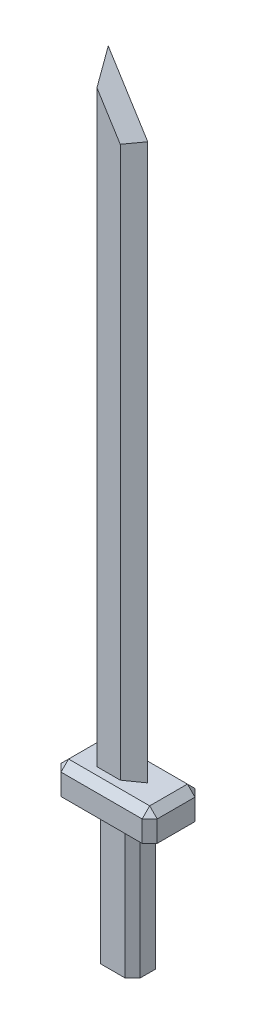
ISO-10303-21;
HEADER;
FILE_DESCRIPTION(('STEP AP214'),'2;1');
FILE_NAME('part.step','',(''),(''),'','','');
FILE_SCHEMA(('AUTOMOTIVE_DESIGN { 1 0 10303 214 1 1 1 1 }'));
ENDSEC;
DATA;
#1=APPLICATION_CONTEXT('core data for automotive mechanical design processes');
#2=APPLICATION_PROTOCOL_DEFINITION('international standard','automotive_design',2000,#1);
#3=PRODUCT_CONTEXT('',#1,'mechanical');
#4=PRODUCT('Part','Part','',(#3));
#5=PRODUCT_RELATED_PRODUCT_CATEGORY('part','',(#4));
#6=PRODUCT_DEFINITION_FORMATION('','',#4);
#7=PRODUCT_DEFINITION_CONTEXT('part definition',#1,'design');
#8=PRODUCT_DEFINITION('design','',#6,#7);
#9=PRODUCT_DEFINITION_SHAPE('','',#8);
#10=(LENGTH_UNIT() NAMED_UNIT(*) SI_UNIT(.MILLI.,.METRE.));
#11=(NAMED_UNIT(*) PLANE_ANGLE_UNIT() SI_UNIT($,.RADIAN.));
#12=(NAMED_UNIT(*) SI_UNIT($,.STERADIAN.) SOLID_ANGLE_UNIT());
#13=UNCERTAINTY_MEASURE_WITH_UNIT(LENGTH_MEASURE(1.E-05),#10,'distance_accuracy_value','');
#14=(GEOMETRIC_REPRESENTATION_CONTEXT(3) GLOBAL_UNCERTAINTY_ASSIGNED_CONTEXT((#13)) GLOBAL_UNIT_ASSIGNED_CONTEXT((#10,
#11,#12)) REPRESENTATION_CONTEXT('',''));
#15=CARTESIAN_POINT('',(0.,0.,0.));
#16=DIRECTION('',(0.,0.,1.));
#17=DIRECTION('',(1.,0.,0.));
#18=AXIS2_PLACEMENT_3D('',#15,#16,#17);
#19=CARTESIAN_POINT('',(-3.75819288838855,-3.80650951497684,3.5));
#20=DIRECTION('',(0.,1.,0.));
#21=DIRECTION('',(-1.,0.,0.));
#22=AXIS2_PLACEMENT_3D('',#19,#20,#21);
#23=PLANE('',#22);
#24=DIRECTION('',(1.,0.,0.));
#25=VECTOR('',#24,1.);
#26=CARTESIAN_POINT('',(-3.75819288838855,-3.80650951497684,-3.5));
#27=LINE('',#26,#25);
#28=CARTESIAN_POINT('',(-2.75819288838855,-3.80650951497684,-3.5));
#29=VERTEX_POINT('',#28);
#30=CARTESIAN_POINT('',(7.98968582877229,-3.80650951497684,-3.5));
#31=VERTEX_POINT('',#30);
#32=EDGE_CURVE('E359',#29,#31,#27,.T.);
#33=ORIENTED_EDGE('',*,*,#32,.T.);
#34=DIRECTION('',(0.707106781186548,0.,0.707106781186548));
#35=VECTOR('',#34,1.);
#36=CARTESIAN_POINT('',(7.98968582877228,-3.80650951497684,-3.50000000000001));
#37=LINE('',#36,#35);
#38=CARTESIAN_POINT('',(8.98968582877229,-3.80650951497684,-2.5));
#39=VERTEX_POINT('',#38);
#40=EDGE_CURVE('E311',#31,#39,#37,.T.);
#41=ORIENTED_EDGE('',*,*,#40,.T.);
#42=DIRECTION('',(0.,0.,-1.));
#43=VECTOR('',#42,1.);
#44=CARTESIAN_POINT('',(8.98968582877229,-3.80650951497684,3.5));
#45=LINE('',#44,#43);
#46=CARTESIAN_POINT('',(8.98968582877229,-3.80650951497684,2.5));
#47=VERTEX_POINT('',#46);
#48=EDGE_CURVE('E355',#47,#39,#45,.T.);
#49=ORIENTED_EDGE('',*,*,#48,.F.);
#50=DIRECTION('',(0.707106781186548,0.,-0.707106781186548));
#51=VECTOR('',#50,1.);
#52=CARTESIAN_POINT('',(8.98968582877228,-3.80650951497684,2.50000000000001));
#53=LINE('',#52,#51);
#54=CARTESIAN_POINT('',(7.98968582877229,-3.80650951497684,3.5));
#55=VERTEX_POINT('',#54);
#56=EDGE_CURVE('E315',#47,#55,#53,.F.);
#57=ORIENTED_EDGE('',*,*,#56,.T.);
#58=DIRECTION('',(1.,0.,0.));
#59=VECTOR('',#58,1.);
#60=CARTESIAN_POINT('',(-3.75819288838855,-3.80650951497684,3.5));
#61=LINE('',#60,#59);
#62=CARTESIAN_POINT('',(-2.75819288838855,-3.80650951497684,3.5));
#63=VERTEX_POINT('',#62);
#64=EDGE_CURVE('E358',#63,#55,#61,.T.);
#65=ORIENTED_EDGE('',*,*,#64,.F.);
#66=DIRECTION('',(-0.707106781186548,0.,-0.707106781186548));
#67=VECTOR('',#66,1.);
#68=CARTESIAN_POINT('',(-2.75819288838855,-3.80650951497684,3.5));
#69=LINE('',#68,#67);
#70=CARTESIAN_POINT('',(-3.75819288838855,-3.80650951497684,2.5));
#71=VERTEX_POINT('',#70);
#72=EDGE_CURVE('E317',#63,#71,#69,.T.);
#73=ORIENTED_EDGE('',*,*,#72,.T.);
#74=DIRECTION('',(0.,0.,-1.));
#75=VECTOR('',#74,1.);
#76=CARTESIAN_POINT('',(-3.75819288838855,-3.80650951497684,3.5));
#77=LINE('',#76,#75);
#78=CARTESIAN_POINT('',(-3.75819288838855,-3.80650951497684,-2.5));
#79=VERTEX_POINT('',#78);
#80=EDGE_CURVE('E349',#71,#79,#77,.T.);
#81=ORIENTED_EDGE('',*,*,#80,.T.);
#82=DIRECTION('',(-0.707106781186548,0.,0.707106781186548));
#83=VECTOR('',#82,1.);
#84=CARTESIAN_POINT('',(-3.75819288838855,-3.80650951497684,-2.5));
#85=LINE('',#84,#83);
#86=EDGE_CURVE('E313',#79,#29,#85,.F.);
#87=ORIENTED_EDGE('',*,*,#86,.T.);
#88=EDGE_LOOP('',(#33,#41,#49,#57,#65,#73,#81,#87));
#89=FACE_BOUND('',#88,.T.);
#90=DIRECTION('',(1.,0.,0.));
#91=VECTOR('',#90,1.);
#92=CARTESIAN_POINT('',(0.,-3.80650951497684,-2.));
#93=LINE('',#92,#91);
#94=CARTESIAN_POINT('',(1.,-3.80650951497684,-2.));
#95=VERTEX_POINT('',#94);
#96=CARTESIAN_POINT('',(4.23149294038372,-3.80650951497684,-2.));
#97=VERTEX_POINT('',#96);
#98=EDGE_CURVE('E233',#95,#97,#93,.T.);
#99=ORIENTED_EDGE('',*,*,#98,.F.);
#100=DIRECTION('',(-0.707106781186548,0.,0.707106781186548));
#101=VECTOR('',#100,1.);
#102=CARTESIAN_POINT('',(-4.12909644419427,-3.80650951497684,3.12909644419428));
#103=LINE('',#102,#101);
#104=CARTESIAN_POINT('',(0.,-3.80650951497684,-0.999999999999999));
#105=VERTEX_POINT('',#104);
#106=EDGE_CURVE('E267',#95,#105,#103,.T.);
#107=ORIENTED_EDGE('',*,*,#106,.T.);
#108=DIRECTION('',(0.,0.,-1.));
#109=VECTOR('',#108,1.);
#110=CARTESIAN_POINT('',(0.,-3.80650951497684,2.));
#111=LINE('',#110,#109);
#112=CARTESIAN_POINT('',(0.,-3.80650951497684,0.999999999999999));
#113=VERTEX_POINT('',#112);
#114=EDGE_CURVE('E362',#113,#105,#111,.T.);
#115=ORIENTED_EDGE('',*,*,#114,.F.);
#116=DIRECTION('',(-0.707106781186548,0.,-0.707106781186548));
#117=VECTOR('',#116,1.);
#118=CARTESIAN_POINT('',(-0.629096444194275,-3.80650951497684,0.370903555805724));
#119=LINE('',#118,#117);
#120=CARTESIAN_POINT('',(1.,-3.80650951497684,2.));
#121=VERTEX_POINT('',#120);
#122=EDGE_CURVE('E229',#113,#121,#119,.F.);
#123=ORIENTED_EDGE('',*,*,#122,.T.);
#124=DIRECTION('',(1.,0.,0.));
#125=VECTOR('',#124,1.);
#126=CARTESIAN_POINT('',(0.,-3.80650951497684,2.));
#127=LINE('',#126,#125);
#128=CARTESIAN_POINT('',(4.23149294038372,-3.80650951497684,2.));
#129=VERTEX_POINT('',#128);
#130=EDGE_CURVE('E380',#121,#129,#127,.T.);
#131=ORIENTED_EDGE('',*,*,#130,.T.);
#132=DIRECTION('',(0.707106781186548,0.,-0.707106781186547));
#133=VECTOR('',#132,1.);
#134=CARTESIAN_POINT('',(-0.513349974002418,-3.80650951497684,6.74484291438613));
#135=LINE('',#134,#133);
#136=CARTESIAN_POINT('',(5.23149294038372,-3.80650951497684,0.999999999999999));
#137=VERTEX_POINT('',#136);
#138=EDGE_CURVE('E265',#129,#137,#135,.T.);
#139=ORIENTED_EDGE('',*,*,#138,.T.);
#140=DIRECTION('',(0.,0.,-1.));
#141=VECTOR('',#140,1.);
#142=CARTESIAN_POINT('',(5.23149294038372,-3.80650951497684,2.));
#143=LINE('',#142,#141);
#144=CARTESIAN_POINT('',(5.23149294038372,-3.80650951497684,-0.999999999999999));
#145=VERTEX_POINT('',#144);
#146=EDGE_CURVE('E365',#137,#145,#143,.T.);
#147=ORIENTED_EDGE('',*,*,#146,.T.);
#148=DIRECTION('',(0.707106781186548,0.,0.707106781186547));
#149=VECTOR('',#148,1.);
#150=CARTESIAN_POINT('',(2.98665002599758,-3.80650951497684,-3.24484291438614));
#151=LINE('',#150,#149);
#152=EDGE_CURVE('E269',#145,#97,#151,.F.);
#153=ORIENTED_EDGE('',*,*,#152,.T.);
#154=EDGE_LOOP('',(#99,#107,#115,#123,#131,#139,#147,#153));
#155=FACE_BOUND('',#154,.T.);
#156=ADVANCED_FACE('F33',(#89,#155),#23,.F.);
#157=CARTESIAN_POINT('',(0.,0.,1.5));
#158=DIRECTION('',(-1.,0.,0.));
#159=DIRECTION('',(0.,0.,1.));
#160=AXIS2_PLACEMENT_3D('',#157,#158,#159);
#161=PLANE('',#160);
#162=DIRECTION('',(0.,1.,0.));
#163=VECTOR('',#162,1.);
#164=CARTESIAN_POINT('',(0.,0.,1.5));
#165=LINE('',#164,#163);
#166=CARTESIAN_POINT('',(0.,0.,1.5));
#167=VERTEX_POINT('',#166);
#168=CARTESIAN_POINT('',(0.,77.9007353647012,1.5));
#169=VERTEX_POINT('',#168);
#170=EDGE_CURVE('E344',#167,#169,#165,.T.);
#171=ORIENTED_EDGE('',*,*,#170,.T.);
#172=DIRECTION('',(0.,-0.937516509562209,0.347940791368722));
#173=VECTOR('',#172,1.);
#174=CARTESIAN_POINT('',(0.,9.43088070114253,26.9112382806621));
#175=LINE('',#174,#173);
#176=CARTESIAN_POINT('',(0.,81.9424424574837,0.));
#177=VERTEX_POINT('',#176);
#178=EDGE_CURVE('E223',#169,#177,#175,.F.);
#179=ORIENTED_EDGE('',*,*,#178,.T.);
#180=DIRECTION('',(0.,-0.937516509562209,-0.347940791368722));
#181=VECTOR('',#180,1.);
#182=CARTESIAN_POINT('',(0.,10.4094814099175,-26.5480498977673));
#183=LINE('',#182,#181);
#184=CARTESIAN_POINT('',(0.,77.9007353647012,-1.5));
#185=VERTEX_POINT('',#184);
#186=EDGE_CURVE('E210',#177,#185,#183,.T.);
#187=ORIENTED_EDGE('',*,*,#186,.T.);
#188=DIRECTION('',(0.,1.,0.));
#189=VECTOR('',#188,1.);
#190=CARTESIAN_POINT('',(0.,0.,-1.5));
#191=LINE('',#190,#189);
#192=CARTESIAN_POINT('',(0.,0.,-1.5));
#193=VERTEX_POINT('',#192);
#194=EDGE_CURVE('E345',#193,#185,#191,.T.);
#195=ORIENTED_EDGE('',*,*,#194,.F.);
#196=DIRECTION('',(0.,0.,-1.));
#197=VECTOR('',#196,1.);
#198=CARTESIAN_POINT('',(0.,0.,1.5));
#199=LINE('',#198,#197);
#200=EDGE_CURVE('E341',#167,#193,#199,.T.);
#201=ORIENTED_EDGE('',*,*,#200,.F.);
#202=EDGE_LOOP('',(#171,#179,#187,#195,#201));
#203=FACE_BOUND('',#202,.T.);
#204=ADVANCED_FACE('F435',(#203),#161,.T.);
#205=CARTESIAN_POINT('',(0.,0.,1.5));
#206=DIRECTION('',(0.,0.,1.));
#207=DIRECTION('',(1.,0.,0.));
#208=AXIS2_PLACEMENT_3D('',#205,#206,#207);
#209=PLANE('',#208);
#210=DIRECTION('',(0.,1.,0.));
#211=VECTOR('',#210,1.);
#212=CARTESIAN_POINT('',(3.08927093027055,0.,1.5));
#213=LINE('',#212,#211);
#214=CARTESIAN_POINT('',(3.08927093027055,0.,1.5));
#215=VERTEX_POINT('',#214);
#216=CARTESIAN_POINT('',(3.08927093027055,72.958291843573,1.5));
#217=VERTEX_POINT('',#216);
#218=EDGE_CURVE('E227',#215,#217,#213,.T.);
#219=ORIENTED_EDGE('',*,*,#218,.T.);
#220=DIRECTION('',(-0.530029010251303,0.847979509358584,0.));
#221=VECTOR('',#220,1.);
#222=CARTESIAN_POINT('',(35.0127768629892,21.8847121446096,1.5));
#223=LINE('',#222,#221);
#224=EDGE_CURVE('E216',#217,#169,#223,.T.);
#225=ORIENTED_EDGE('',*,*,#224,.T.);
#226=ORIENTED_EDGE('',*,*,#170,.F.);
#227=DIRECTION('',(-1.,0.,0.));
#228=VECTOR('',#227,1.);
#229=CARTESIAN_POINT('',(0.,0.,1.5));
#230=LINE('',#229,#228);
#231=EDGE_CURVE('E347',#215,#167,#230,.T.);
#232=ORIENTED_EDGE('',*,*,#231,.F.);
#233=EDGE_LOOP('',(#219,#225,#226,#232));
#234=FACE_BOUND('',#233,.T.);
#235=ADVANCED_FACE('F441',(#234),#209,.T.);
#236=CARTESIAN_POINT('',(0.,0.,-1.5));
#237=DIRECTION('',(0.,0.,1.));
#238=DIRECTION('',(1.,0.,0.));
#239=AXIS2_PLACEMENT_3D('',#236,#237,#238);
#240=PLANE('',#239);
#241=ORIENTED_EDGE('',*,*,#194,.T.);
#242=DIRECTION('',(0.530029010251303,-0.847979509358584,0.));
#243=VECTOR('',#242,1.);
#244=CARTESIAN_POINT('',(3.4149325713108,72.4372743270878,-1.5));
#245=LINE('',#244,#243);
#246=CARTESIAN_POINT('',(3.08927093027055,72.958291843573,-1.5));
#247=VERTEX_POINT('',#246);
#248=EDGE_CURVE('E220',#185,#247,#245,.T.);
#249=ORIENTED_EDGE('',*,*,#248,.T.);
#250=DIRECTION('',(0.,-1.,0.));
#251=VECTOR('',#250,1.);
#252=CARTESIAN_POINT('',(3.08927093027055,0.,-1.5));
#253=LINE('',#252,#251);
#254=CARTESIAN_POINT('',(3.08927093027055,0.,-1.5));
#255=VERTEX_POINT('',#254);
#256=EDGE_CURVE('E195',#247,#255,#253,.T.);
#257=ORIENTED_EDGE('',*,*,#256,.T.);
#258=DIRECTION('',(-1.,0.,0.));
#259=VECTOR('',#258,1.);
#260=CARTESIAN_POINT('',(0.,0.,-1.5));
#261=LINE('',#260,#259);
#262=EDGE_CURVE('E186',#255,#193,#261,.T.);
#263=ORIENTED_EDGE('',*,*,#262,.T.);
#264=EDGE_LOOP('',(#241,#249,#257,#263));
#265=FACE_BOUND('',#264,.T.);
#266=ADVANCED_FACE('F455',(#265),#240,.F.);
#267=CARTESIAN_POINT('',(-3.75819288838855,0.,3.5));
#268=DIRECTION('',(0.,1.,0.));
#269=DIRECTION('',(0.,0.,1.));
#270=AXIS2_PLACEMENT_3D('',#267,#268,#269);
#271=PLANE('',#270);
#272=DIRECTION('',(1.,0.,0.));
#273=VECTOR('',#272,1.);
#274=CARTESIAN_POINT('',(-3.75819288838855,0.,2.5));
#275=LINE('',#274,#273);
#276=CARTESIAN_POINT('',(-2.75819288838855,0.,2.5));
#277=VERTEX_POINT('',#276);
#278=CARTESIAN_POINT('',(7.98968582877227,0.,2.5));
#279=VERTEX_POINT('',#278);
#280=EDGE_CURVE('E339',#277,#279,#275,.T.);
#281=ORIENTED_EDGE('',*,*,#280,.T.);
#282=DIRECTION('',(0.,0.,-1.));
#283=VECTOR('',#282,1.);
#284=CARTESIAN_POINT('',(7.98968582877227,0.,3.5));
#285=LINE('',#284,#283);
#286=CARTESIAN_POINT('',(7.98968582877227,0.,-2.5));
#287=VERTEX_POINT('',#286);
#288=EDGE_CURVE('E332',#279,#287,#285,.T.);
#289=ORIENTED_EDGE('',*,*,#288,.T.);
#290=DIRECTION('',(-1.,0.,0.));
#291=VECTOR('',#290,1.);
#292=CARTESIAN_POINT('',(-3.75819288838855,0.,-2.5));
#293=LINE('',#292,#291);
#294=CARTESIAN_POINT('',(-2.75819288838855,0.,-2.5));
#295=VERTEX_POINT('',#294);
#296=EDGE_CURVE('E335',#287,#295,#293,.T.);
#297=ORIENTED_EDGE('',*,*,#296,.T.);
#298=DIRECTION('',(0.,0.,1.));
#299=VECTOR('',#298,1.);
#300=CARTESIAN_POINT('',(-2.75819288838855,0.,3.5));
#301=LINE('',#300,#299);
#302=EDGE_CURVE('E337',#295,#277,#301,.T.);
#303=ORIENTED_EDGE('',*,*,#302,.T.);
#304=EDGE_LOOP('',(#281,#289,#297,#303));
#305=FACE_BOUND('',#304,.T.);
#306=ORIENTED_EDGE('',*,*,#262,.F.);
#307=DIRECTION('',(0.819152044288992,0.,0.573576436351046));
#308=VECTOR('',#307,1.);
#309=CARTESIAN_POINT('',(3.08927093027055,0.,-1.5));
#310=LINE('',#309,#308);
#311=CARTESIAN_POINT('',(5.23149294038372,0.,0.));
#312=VERTEX_POINT('',#311);
#313=EDGE_CURVE('E11',#255,#312,#310,.T.);
#314=ORIENTED_EDGE('',*,*,#313,.T.);
#315=DIRECTION('',(0.819152044288992,0.,-0.573576436351046));
#316=VECTOR('',#315,1.);
#317=CARTESIAN_POINT('',(5.23149294038372,0.,0.));
#318=LINE('',#317,#316);
#319=EDGE_CURVE('E43',#312,#215,#318,.F.);
#320=ORIENTED_EDGE('',*,*,#319,.T.);
#321=ORIENTED_EDGE('',*,*,#231,.T.);
#322=ORIENTED_EDGE('',*,*,#200,.T.);
#323=EDGE_LOOP('',(#306,#314,#320,#321,#322));
#324=FACE_BOUND('',#323,.T.);
#325=ADVANCED_FACE('F451',(#305,#324),#271,.T.);
#326=CARTESIAN_POINT('',(-3.75819288838855,0.,3.5));
#327=DIRECTION('',(1.,0.,0.));
#328=DIRECTION('',(0.,0.,-1.));
#329=AXIS2_PLACEMENT_3D('',#326,#327,#328);
#330=PLANE('',#329);
#331=DIRECTION('',(0.,0.,-1.));
#332=VECTOR('',#331,1.);
#333=CARTESIAN_POINT('',(-3.75819288838855,-1.,-3.5));
#334=LINE('',#333,#332);
#335=CARTESIAN_POINT('',(-3.75819288838855,-1.,2.5));
#336=VERTEX_POINT('',#335);
#337=CARTESIAN_POINT('',(-3.75819288838855,-1.,-2.5));
#338=VERTEX_POINT('',#337);
#339=EDGE_CURVE('E307',#336,#338,#334,.T.);
#340=ORIENTED_EDGE('',*,*,#339,.T.);
#341=DIRECTION('',(0.,-1.,0.));
#342=VECTOR('',#341,1.);
#343=CARTESIAN_POINT('',(-3.75819288838855,0.,-2.5));
#344=LINE('',#343,#342);
#345=EDGE_CURVE('E305',#338,#79,#344,.T.);
#346=ORIENTED_EDGE('',*,*,#345,.T.);
#347=ORIENTED_EDGE('',*,*,#80,.F.);
#348=DIRECTION('',(0.,1.,0.));
#349=VECTOR('',#348,1.);
#350=CARTESIAN_POINT('',(-3.75819288838855,0.,2.5));
#351=LINE('',#350,#349);
#352=EDGE_CURVE('E309',#71,#336,#351,.T.);
#353=ORIENTED_EDGE('',*,*,#352,.T.);
#354=EDGE_LOOP('',(#340,#346,#347,#353));
#355=FACE_BOUND('',#354,.T.);
#356=ADVANCED_FACE('F448',(#355),#330,.F.);
#357=CARTESIAN_POINT('',(8.98968582877227,0.,3.5));
#358=DIRECTION('',(1.,0.,0.));
#359=DIRECTION('',(0.,1.,0.));
#360=AXIS2_PLACEMENT_3D('',#357,#358,#359);
#361=PLANE('',#360);
#362=ORIENTED_EDGE('',*,*,#48,.T.);
#363=DIRECTION('',(0.,1.,0.));
#364=VECTOR('',#363,1.);
#365=CARTESIAN_POINT('',(8.98968582877227,0.,-2.5));
#366=LINE('',#365,#364);
#367=CARTESIAN_POINT('',(8.98968582877227,-0.999999999999997,-2.5));
#368=VERTEX_POINT('',#367);
#369=EDGE_CURVE('E325',#39,#368,#366,.T.);
#370=ORIENTED_EDGE('',*,*,#369,.T.);
#371=DIRECTION('',(0.,0.,1.));
#372=VECTOR('',#371,1.);
#373=CARTESIAN_POINT('',(8.98968582877227,-0.999999999999997,3.5));
#374=LINE('',#373,#372);
#375=CARTESIAN_POINT('',(8.98968582877227,-0.999999999999997,2.5));
#376=VERTEX_POINT('',#375);
#377=EDGE_CURVE('E327',#368,#376,#374,.T.);
#378=ORIENTED_EDGE('',*,*,#377,.T.);
#379=DIRECTION('',(0.,-1.,0.));
#380=VECTOR('',#379,1.);
#381=CARTESIAN_POINT('',(8.98968582877227,0.,2.5));
#382=LINE('',#381,#380);
#383=EDGE_CURVE('E330',#376,#47,#382,.T.);
#384=ORIENTED_EDGE('',*,*,#383,.T.);
#385=EDGE_LOOP('',(#362,#370,#378,#384));
#386=FACE_BOUND('',#385,.T.);
#387=ADVANCED_FACE('F446',(#386),#361,.T.);
#388=CARTESIAN_POINT('',(0.,0.,3.5));
#389=DIRECTION('',(0.,0.,1.));
#390=DIRECTION('',(1.,0.,0.));
#391=AXIS2_PLACEMENT_3D('',#388,#389,#390);
#392=PLANE('',#391);
#393=ORIENTED_EDGE('',*,*,#64,.T.);
#394=DIRECTION('',(0.,1.,0.));
#395=VECTOR('',#394,1.);
#396=CARTESIAN_POINT('',(7.98968582877227,0.,3.5));
#397=LINE('',#396,#395);
#398=CARTESIAN_POINT('',(7.98968582877227,-1.,3.5));
#399=VERTEX_POINT('',#398);
#400=EDGE_CURVE('E299',#55,#399,#397,.T.);
#401=ORIENTED_EDGE('',*,*,#400,.T.);
#402=DIRECTION('',(-1.,0.,0.));
#403=VECTOR('',#402,1.);
#404=CARTESIAN_POINT('',(0.,-1.,3.5));
#405=LINE('',#404,#403);
#406=CARTESIAN_POINT('',(-2.75819288838855,-1.,3.5));
#407=VERTEX_POINT('',#406);
#408=EDGE_CURVE('E301',#399,#407,#405,.T.);
#409=ORIENTED_EDGE('',*,*,#408,.T.);
#410=DIRECTION('',(0.,-1.,0.));
#411=VECTOR('',#410,1.);
#412=CARTESIAN_POINT('',(-2.75819288838855,-3.80650951497684,3.5));
#413=LINE('',#412,#411);
#414=EDGE_CURVE('E303',#407,#63,#413,.T.);
#415=ORIENTED_EDGE('',*,*,#414,.T.);
#416=EDGE_LOOP('',(#393,#401,#409,#415));
#417=FACE_BOUND('',#416,.T.);
#418=ADVANCED_FACE('F631',(#417),#392,.T.);
#419=CARTESIAN_POINT('',(0.,0.,-3.5));
#420=DIRECTION('',(0.,0.,1.));
#421=DIRECTION('',(1.,0.,0.));
#422=AXIS2_PLACEMENT_3D('',#419,#420,#421);
#423=PLANE('',#422);
#424=DIRECTION('',(1.,0.,0.));
#425=VECTOR('',#424,1.);
#426=CARTESIAN_POINT('',(8.98968582877227,-1.,-3.5));
#427=LINE('',#426,#425);
#428=CARTESIAN_POINT('',(-2.75819288838855,-1.,-3.5));
#429=VERTEX_POINT('',#428);
#430=CARTESIAN_POINT('',(7.98968582877227,-1.,-3.5));
#431=VERTEX_POINT('',#430);
#432=EDGE_CURVE('E321',#429,#431,#427,.T.);
#433=ORIENTED_EDGE('',*,*,#432,.T.);
#434=DIRECTION('',(0.,-1.,0.));
#435=VECTOR('',#434,1.);
#436=CARTESIAN_POINT('',(7.98968582877229,-3.80650951497684,-3.5));
#437=LINE('',#436,#435);
#438=EDGE_CURVE('E319',#431,#31,#437,.T.);
#439=ORIENTED_EDGE('',*,*,#438,.T.);
#440=ORIENTED_EDGE('',*,*,#32,.F.);
#441=DIRECTION('',(0.,1.,0.));
#442=VECTOR('',#441,1.);
#443=CARTESIAN_POINT('',(-2.75819288838855,0.,-3.5));
#444=LINE('',#443,#442);
#445=EDGE_CURVE('E323',#29,#429,#444,.T.);
#446=ORIENTED_EDGE('',*,*,#445,.T.);
#447=EDGE_LOOP('',(#433,#439,#440,#446));
#448=FACE_BOUND('',#447,.T.);
#449=ADVANCED_FACE('F621',(#448),#423,.F.);
#450=CARTESIAN_POINT('',(0.,-3.80650951497684,2.));
#451=DIRECTION('',(1.,0.,0.));
#452=DIRECTION('',(0.,1.,0.));
#453=AXIS2_PLACEMENT_3D('',#450,#451,#452);
#454=PLANE('',#453);
#455=ORIENTED_EDGE('',*,*,#114,.T.);
#456=DIRECTION('',(0.,-1.,0.));
#457=VECTOR('',#456,1.);
#458=CARTESIAN_POINT('',(0.,-21.8811840392301,-0.999999999999999));
#459=LINE('',#458,#457);
#460=CARTESIAN_POINT('',(0.,-21.8811840392301,-0.999999999999999));
#461=VERTEX_POINT('',#460);
#462=EDGE_CURVE('E276',#105,#461,#459,.T.);
#463=ORIENTED_EDGE('',*,*,#462,.T.);
#464=DIRECTION('',(0.,0.,-1.));
#465=VECTOR('',#464,1.);
#466=CARTESIAN_POINT('',(0.,-21.8811840392301,2.));
#467=LINE('',#466,#465);
#468=CARTESIAN_POINT('',(0.,-21.8811840392301,0.999999999999999));
#469=VERTEX_POINT('',#468);
#470=EDGE_CURVE('E372',#469,#461,#467,.T.);
#471=ORIENTED_EDGE('',*,*,#470,.F.);
#472=DIRECTION('',(0.,1.,0.));
#473=VECTOR('',#472,1.);
#474=CARTESIAN_POINT('',(0.,-3.80650951497684,0.999999999999999));
#475=LINE('',#474,#473);
#476=EDGE_CURVE('E279',#469,#113,#475,.T.);
#477=ORIENTED_EDGE('',*,*,#476,.T.);
#478=EDGE_LOOP('',(#455,#463,#471,#477));
#479=FACE_BOUND('',#478,.T.);
#480=ADVANCED_FACE('F420',(#479),#454,.F.);
#481=CARTESIAN_POINT('',(0.,-21.8811840392301,2.));
#482=DIRECTION('',(0.,1.,0.));
#483=DIRECTION('',(0.,0.,1.));
#484=AXIS2_PLACEMENT_3D('',#481,#482,#483);
#485=PLANE('',#484);
#486=DIRECTION('',(1.,0.,0.));
#487=VECTOR('',#486,1.);
#488=CARTESIAN_POINT('',(0.,-21.8811840392301,-2.));
#489=LINE('',#488,#487);
#490=CARTESIAN_POINT('',(1.,-21.8811840392301,-2.));
#491=VERTEX_POINT('',#490);
#492=CARTESIAN_POINT('',(4.23149294038372,-21.8811840392301,-2.));
#493=VERTEX_POINT('',#492);
#494=EDGE_CURVE('E377',#491,#493,#489,.T.);
#495=ORIENTED_EDGE('',*,*,#494,.T.);
#496=DIRECTION('',(-0.707106781186548,0.,-0.707106781186547));
#497=VECTOR('',#496,1.);
#498=CARTESIAN_POINT('',(4.23149294038372,-21.8811840392301,-2.));
#499=LINE('',#498,#497);
#500=CARTESIAN_POINT('',(5.23149294038372,-21.8811840392301,-0.999999999999999));
#501=VERTEX_POINT('',#500);
#502=EDGE_CURVE('E286',#493,#501,#499,.F.);
#503=ORIENTED_EDGE('',*,*,#502,.T.);
#504=DIRECTION('',(0.,0.,-1.));
#505=VECTOR('',#504,1.);
#506=CARTESIAN_POINT('',(5.23149294038372,-21.8811840392301,2.));
#507=LINE('',#506,#505);
#508=CARTESIAN_POINT('',(5.23149294038372,-21.8811840392301,0.999999999999999));
#509=VERTEX_POINT('',#508);
#510=EDGE_CURVE('E368',#509,#501,#507,.T.);
#511=ORIENTED_EDGE('',*,*,#510,.F.);
#512=DIRECTION('',(-0.707106781186548,0.,0.707106781186547));
#513=VECTOR('',#512,1.);
#514=CARTESIAN_POINT('',(5.23149294038372,-21.8811840392301,0.999999999999998));
#515=LINE('',#514,#513);
#516=CARTESIAN_POINT('',(4.23149294038372,-21.8811840392301,2.));
#517=VERTEX_POINT('',#516);
#518=EDGE_CURVE('E290',#509,#517,#515,.T.);
#519=ORIENTED_EDGE('',*,*,#518,.T.);
#520=DIRECTION('',(1.,0.,0.));
#521=VECTOR('',#520,1.);
#522=CARTESIAN_POINT('',(0.,-21.8811840392301,2.));
#523=LINE('',#522,#521);
#524=CARTESIAN_POINT('',(1.,-21.8811840392301,2.));
#525=VERTEX_POINT('',#524);
#526=EDGE_CURVE('E369',#525,#517,#523,.T.);
#527=ORIENTED_EDGE('',*,*,#526,.F.);
#528=DIRECTION('',(0.707106781186548,0.,0.707106781186548));
#529=VECTOR('',#528,1.);
#530=CARTESIAN_POINT('',(1.,-21.8811840392301,2.));
#531=LINE('',#530,#529);
#532=EDGE_CURVE('E292',#525,#469,#531,.F.);
#533=ORIENTED_EDGE('',*,*,#532,.T.);
#534=ORIENTED_EDGE('',*,*,#470,.T.);
#535=DIRECTION('',(0.707106781186548,0.,-0.707106781186548));
#536=VECTOR('',#535,1.);
#537=CARTESIAN_POINT('',(0.,-21.8811840392301,-0.999999999999998));
#538=LINE('',#537,#536);
#539=EDGE_CURVE('E288',#461,#491,#538,.T.);
#540=ORIENTED_EDGE('',*,*,#539,.T.);
#541=EDGE_LOOP('',(#495,#503,#511,#519,#527,#533,#534,#540));
#542=FACE_BOUND('',#541,.T.);
#543=ADVANCED_FACE('F404',(#542),#485,.F.);
#544=CARTESIAN_POINT('',(5.23149294038372,-3.80650951497684,2.));
#545=DIRECTION('',(1.,0.,0.));
#546=DIRECTION('',(0.,1.,0.));
#547=AXIS2_PLACEMENT_3D('',#544,#545,#546);
#548=PLANE('',#547);
#549=ORIENTED_EDGE('',*,*,#510,.T.);
#550=DIRECTION('',(0.,1.,0.));
#551=VECTOR('',#550,1.);
#552=CARTESIAN_POINT('',(5.23149294038372,-3.80650951497684,-0.999999999999999));
#553=LINE('',#552,#551);
#554=EDGE_CURVE('E281',#501,#145,#553,.T.);
#555=ORIENTED_EDGE('',*,*,#554,.T.);
#556=ORIENTED_EDGE('',*,*,#146,.F.);
#557=DIRECTION('',(0.,-1.,0.));
#558=VECTOR('',#557,1.);
#559=CARTESIAN_POINT('',(5.23149294038372,-21.8811840392301,0.999999999999999));
#560=LINE('',#559,#558);
#561=EDGE_CURVE('E283',#137,#509,#560,.T.);
#562=ORIENTED_EDGE('',*,*,#561,.T.);
#563=EDGE_LOOP('',(#549,#555,#556,#562));
#564=FACE_BOUND('',#563,.T.);
#565=ADVANCED_FACE('F401',(#564),#548,.T.);
#566=CARTESIAN_POINT('',(0.,0.,2.));
#567=DIRECTION('',(0.,0.,-1.));
#568=DIRECTION('',(-1.,0.,0.));
#569=AXIS2_PLACEMENT_3D('',#566,#567,#568);
#570=PLANE('',#569);
#571=ORIENTED_EDGE('',*,*,#526,.T.);
#572=DIRECTION('',(0.,1.,0.));
#573=VECTOR('',#572,1.);
#574=CARTESIAN_POINT('',(4.23149294038372,-3.80650951497684,2.));
#575=LINE('',#574,#573);
#576=EDGE_CURVE('E271',#517,#129,#575,.T.);
#577=ORIENTED_EDGE('',*,*,#576,.T.);
#578=ORIENTED_EDGE('',*,*,#130,.F.);
#579=DIRECTION('',(0.,-1.,0.));
#580=VECTOR('',#579,1.);
#581=CARTESIAN_POINT('',(1.,0.,2.));
#582=LINE('',#581,#580);
#583=EDGE_CURVE('E273',#121,#525,#582,.T.);
#584=ORIENTED_EDGE('',*,*,#583,.T.);
#585=EDGE_LOOP('',(#571,#577,#578,#584));
#586=FACE_BOUND('',#585,.T.);
#587=ADVANCED_FACE('F424',(#586),#570,.F.);
#588=CARTESIAN_POINT('',(0.,0.,-2.));
#589=DIRECTION('',(0.,0.,-1.));
#590=DIRECTION('',(-1.,0.,0.));
#591=AXIS2_PLACEMENT_3D('',#588,#589,#590);
#592=PLANE('',#591);
#593=ORIENTED_EDGE('',*,*,#98,.T.);
#594=DIRECTION('',(0.,-1.,0.));
#595=VECTOR('',#594,1.);
#596=CARTESIAN_POINT('',(4.23149294038372,0.,-2.));
#597=LINE('',#596,#595);
#598=EDGE_CURVE('E294',#97,#493,#597,.T.);
#599=ORIENTED_EDGE('',*,*,#598,.T.);
#600=ORIENTED_EDGE('',*,*,#494,.F.);
#601=DIRECTION('',(0.,1.,0.));
#602=VECTOR('',#601,1.);
#603=CARTESIAN_POINT('',(1.,-3.80650951497684,-2.));
#604=LINE('',#603,#602);
#605=EDGE_CURVE('E297',#491,#95,#604,.T.);
#606=ORIENTED_EDGE('',*,*,#605,.T.);
#607=EDGE_LOOP('',(#593,#599,#600,#606));
#608=FACE_BOUND('',#607,.T.);
#609=ADVANCED_FACE('F412',(#608),#592,.T.);
#610=CARTESIAN_POINT('',(-2.75819288838855,0.,3.5));
#611=DIRECTION('',(-0.707106781186547,0.,0.707106781186547));
#612=DIRECTION('',(0.,1.,0.));
#613=AXIS2_PLACEMENT_3D('',#610,#611,#612);
#614=PLANE('',#613);
#615=ORIENTED_EDGE('',*,*,#72,.F.);
#616=ORIENTED_EDGE('',*,*,#414,.F.);
#617=DIRECTION('',(0.707106781186548,0.,0.707106781186548));
#618=VECTOR('',#617,1.);
#619=CARTESIAN_POINT('',(-3.25819288838855,-1.,3.));
#620=LINE('',#619,#618);
#621=EDGE_CURVE('E230',#336,#407,#620,.T.);
#622=ORIENTED_EDGE('',*,*,#621,.F.);
#623=ORIENTED_EDGE('',*,*,#352,.F.);
#624=EDGE_LOOP('',(#615,#616,#622,#623));
#625=FACE_BOUND('',#624,.T.);
#626=ADVANCED_FACE('F431',(#625),#614,.T.);
#627=CARTESIAN_POINT('',(-3.75819288838855,-1.,3.5));
#628=DIRECTION('',(-0.707106781186547,0.707106781186548,0.));
#629=DIRECTION('',(0.,0.,1.));
#630=AXIS2_PLACEMENT_3D('',#627,#628,#629);
#631=PLANE('',#630);
#632=DIRECTION('',(0.707106781186548,0.707106781186547,0.));
#633=VECTOR('',#632,1.);
#634=CARTESIAN_POINT('',(-2.75819288838855,0.,-2.5));
#635=LINE('',#634,#633);
#636=EDGE_CURVE('E237',#338,#295,#635,.T.);
#637=ORIENTED_EDGE('',*,*,#636,.F.);
#638=ORIENTED_EDGE('',*,*,#339,.F.);
#639=DIRECTION('',(-0.707106781186548,-0.707106781186547,0.));
#640=VECTOR('',#639,1.);
#641=CARTESIAN_POINT('',(-2.75819288838855,0.,2.5));
#642=LINE('',#641,#640);
#643=EDGE_CURVE('E234',#277,#336,#642,.T.);
#644=ORIENTED_EDGE('',*,*,#643,.F.);
#645=ORIENTED_EDGE('',*,*,#302,.F.);
#646=EDGE_LOOP('',(#637,#638,#644,#645));
#647=FACE_BOUND('',#646,.T.);
#648=ADVANCED_FACE('F498',(#647),#631,.T.);
#649=CARTESIAN_POINT('',(-3.75819288838855,0.,-2.5));
#650=DIRECTION('',(0.707106781186547,0.,0.707106781186547));
#651=DIRECTION('',(0.,-1.,0.));
#652=AXIS2_PLACEMENT_3D('',#649,#650,#651);
#653=PLANE('',#652);
#654=ORIENTED_EDGE('',*,*,#86,.F.);
#655=ORIENTED_EDGE('',*,*,#345,.F.);
#656=DIRECTION('',(0.707106781186548,0.,-0.707106781186548));
#657=VECTOR('',#656,1.);
#658=CARTESIAN_POINT('',(-3.25819288838855,-1.,-3.));
#659=LINE('',#658,#657);
#660=EDGE_CURVE('E240',#429,#338,#659,.F.);
#661=ORIENTED_EDGE('',*,*,#660,.F.);
#662=ORIENTED_EDGE('',*,*,#445,.F.);
#663=EDGE_LOOP('',(#654,#655,#661,#662));
#664=FACE_BOUND('',#663,.T.);
#665=ADVANCED_FACE('F494',(#664),#653,.F.);
#666=CARTESIAN_POINT('',(-2.75819288838855,0.,2.5));
#667=DIRECTION('',(-0.577350269189626,0.577350269189626,0.577350269189626));
#668=DIRECTION('',(0.,-0.707106781186547,0.707106781186548));
#669=AXIS2_PLACEMENT_3D('',#666,#667,#668);
#670=PLANE('',#669);
#671=ORIENTED_EDGE('',*,*,#643,.T.);
#672=ORIENTED_EDGE('',*,*,#621,.T.);
#673=DIRECTION('',(0.,-0.707106781186547,0.707106781186548));
#674=VECTOR('',#673,1.);
#675=CARTESIAN_POINT('',(-2.75819288838855,0.,2.5));
#676=LINE('',#675,#674);
#677=EDGE_CURVE('E243',#277,#407,#676,.T.);
#678=ORIENTED_EDGE('',*,*,#677,.F.);
#679=EDGE_LOOP('',(#671,#672,#678));
#680=FACE_BOUND('',#679,.T.);
#681=ADVANCED_FACE('F490',(#680),#670,.T.);
#682=CARTESIAN_POINT('',(-2.75819288838855,0.,-2.5));
#683=DIRECTION('',(-0.577350269189626,0.577350269189626,-0.577350269189626));
#684=DIRECTION('',(0.,0.707106781186547,0.707106781186548));
#685=AXIS2_PLACEMENT_3D('',#682,#683,#684);
#686=PLANE('',#685);
#687=ORIENTED_EDGE('',*,*,#660,.T.);
#688=ORIENTED_EDGE('',*,*,#636,.T.);
#689=DIRECTION('',(0.,-0.707106781186547,-0.707106781186548));
#690=VECTOR('',#689,1.);
#691=CARTESIAN_POINT('',(-2.75819288838855,0.,-2.5));
#692=LINE('',#691,#690);
#693=EDGE_CURVE('E246',#429,#295,#692,.F.);
#694=ORIENTED_EDGE('',*,*,#693,.F.);
#695=EDGE_LOOP('',(#687,#688,#694));
#696=FACE_BOUND('',#695,.T.);
#697=ADVANCED_FACE('F486',(#696),#686,.T.);
#698=CARTESIAN_POINT('',(8.98968582877227,0.,2.5));
#699=DIRECTION('',(-0.707106781186547,0.,-0.707106781186547));
#700=DIRECTION('',(0.,-1.,0.));
#701=AXIS2_PLACEMENT_3D('',#698,#699,#700);
#702=PLANE('',#701);
#703=ORIENTED_EDGE('',*,*,#56,.F.);
#704=ORIENTED_EDGE('',*,*,#383,.F.);
#705=DIRECTION('',(-0.707106781186547,0.,0.707106781186547));
#706=VECTOR('',#705,1.);
#707=CARTESIAN_POINT('',(8.98968582877227,-0.999999999999997,2.5));
#708=LINE('',#707,#706);
#709=EDGE_CURVE('E249',#399,#376,#708,.F.);
#710=ORIENTED_EDGE('',*,*,#709,.F.);
#711=ORIENTED_EDGE('',*,*,#400,.F.);
#712=EDGE_LOOP('',(#703,#704,#710,#711));
#713=FACE_BOUND('',#712,.T.);
#714=ADVANCED_FACE('F482',(#713),#702,.F.);
#715=CARTESIAN_POINT('',(-3.75819288838855,0.,2.5));
#716=DIRECTION('',(0.,-0.707106781186548,-0.707106781186547));
#717=DIRECTION('',(1.,0.,0.));
#718=AXIS2_PLACEMENT_3D('',#715,#716,#717);
#719=PLANE('',#718);
#720=ORIENTED_EDGE('',*,*,#677,.T.);
#721=ORIENTED_EDGE('',*,*,#408,.F.);
#722=DIRECTION('',(0.,0.707106781186547,-0.707106781186548));
#723=VECTOR('',#722,1.);
#724=CARTESIAN_POINT('',(7.98968582877227,-0.499999999999998,3.));
#725=LINE('',#724,#723);
#726=EDGE_CURVE('E252',#279,#399,#725,.F.);
#727=ORIENTED_EDGE('',*,*,#726,.F.);
#728=ORIENTED_EDGE('',*,*,#280,.F.);
#729=EDGE_LOOP('',(#720,#721,#727,#728));
#730=FACE_BOUND('',#729,.T.);
#731=ADVANCED_FACE('F478',(#730),#719,.F.);
#732=CARTESIAN_POINT('',(0.,-1.,-3.5));
#733=DIRECTION('',(0.,0.707106781186548,-0.707106781186547));
#734=DIRECTION('',(-1.,0.,0.));
#735=AXIS2_PLACEMENT_3D('',#732,#733,#734);
#736=PLANE('',#735);
#737=ORIENTED_EDGE('',*,*,#693,.T.);
#738=ORIENTED_EDGE('',*,*,#296,.F.);
#739=DIRECTION('',(0.,0.707106781186547,0.707106781186548));
#740=VECTOR('',#739,1.);
#741=CARTESIAN_POINT('',(7.98968582877227,0.,-2.5));
#742=LINE('',#741,#740);
#743=EDGE_CURVE('E255',#431,#287,#742,.T.);
#744=ORIENTED_EDGE('',*,*,#743,.F.);
#745=ORIENTED_EDGE('',*,*,#432,.F.);
#746=EDGE_LOOP('',(#737,#738,#744,#745));
#747=FACE_BOUND('',#746,.T.);
#748=ADVANCED_FACE('F474',(#747),#736,.T.);
#749=CARTESIAN_POINT('',(7.98968582877227,0.,-3.5));
#750=DIRECTION('',(0.707106781186547,0.,-0.707106781186547));
#751=DIRECTION('',(0.,1.,0.));
#752=AXIS2_PLACEMENT_3D('',#749,#750,#751);
#753=PLANE('',#752);
#754=ORIENTED_EDGE('',*,*,#40,.F.);
#755=ORIENTED_EDGE('',*,*,#438,.F.);
#756=DIRECTION('',(-0.707106781186547,0.,-0.707106781186547));
#757=VECTOR('',#756,1.);
#758=CARTESIAN_POINT('',(8.48968582877228,-0.999999999999999,-3.));
#759=LINE('',#758,#757);
#760=EDGE_CURVE('E258',#368,#431,#759,.T.);
#761=ORIENTED_EDGE('',*,*,#760,.F.);
#762=ORIENTED_EDGE('',*,*,#369,.F.);
#763=EDGE_LOOP('',(#754,#755,#761,#762));
#764=FACE_BOUND('',#763,.T.);
#765=ADVANCED_FACE('F470',(#764),#753,.T.);
#766=CARTESIAN_POINT('',(8.98968582877227,-0.999999999999997,2.5));
#767=DIRECTION('',(0.577350269189624,0.577350269189627,0.577350269189626));
#768=DIRECTION('',(0.,-0.707106781186547,0.707106781186548));
#769=AXIS2_PLACEMENT_3D('',#766,#767,#768);
#770=PLANE('',#769);
#771=ORIENTED_EDGE('',*,*,#726,.T.);
#772=ORIENTED_EDGE('',*,*,#709,.T.);
#773=DIRECTION('',(0.707106781186549,-0.707106781186546,0.));
#774=VECTOR('',#773,1.);
#775=CARTESIAN_POINT('',(8.98968582877227,-0.999999999999997,2.5));
#776=LINE('',#775,#774);
#777=EDGE_CURVE('E261',#279,#376,#776,.T.);
#778=ORIENTED_EDGE('',*,*,#777,.F.);
#779=EDGE_LOOP('',(#771,#772,#778));
#780=FACE_BOUND('',#779,.T.);
#781=ADVANCED_FACE('F466',(#780),#770,.T.);
#782=CARTESIAN_POINT('',(7.98968582877227,0.,-2.5));
#783=DIRECTION('',(0.577350269189624,0.577350269189627,-0.577350269189626));
#784=DIRECTION('',(0.,0.707106781186547,0.707106781186548));
#785=AXIS2_PLACEMENT_3D('',#782,#783,#784);
#786=PLANE('',#785);
#787=ORIENTED_EDGE('',*,*,#760,.T.);
#788=ORIENTED_EDGE('',*,*,#743,.T.);
#789=DIRECTION('',(-0.707106781186549,0.707106781186546,0.));
#790=VECTOR('',#789,1.);
#791=CARTESIAN_POINT('',(7.98968582877227,0.,-2.5));
#792=LINE('',#791,#790);
#793=EDGE_CURVE('E199',#368,#287,#792,.T.);
#794=ORIENTED_EDGE('',*,*,#793,.F.);
#795=EDGE_LOOP('',(#787,#788,#794));
#796=FACE_BOUND('',#795,.T.);
#797=ADVANCED_FACE('F462',(#796),#786,.T.);
#798=CARTESIAN_POINT('',(7.98968582877227,0.,3.5));
#799=DIRECTION('',(-0.707106781186546,-0.707106781186549,0.));
#800=DIRECTION('',(0.,0.,-1.));
#801=AXIS2_PLACEMENT_3D('',#798,#799,#800);
#802=PLANE('',#801);
#803=ORIENTED_EDGE('',*,*,#777,.T.);
#804=ORIENTED_EDGE('',*,*,#377,.F.);
#805=ORIENTED_EDGE('',*,*,#793,.T.);
#806=ORIENTED_EDGE('',*,*,#288,.F.);
#807=EDGE_LOOP('',(#803,#804,#805,#806));
#808=FACE_BOUND('',#807,.T.);
#809=ADVANCED_FACE('F459',(#808),#802,.F.);
#810=CARTESIAN_POINT('',(4.23149294038372,0.,-2.));
#811=DIRECTION('',(-0.707106781186547,0.,0.707106781186548));
#812=DIRECTION('',(0.,-1.,0.));
#813=AXIS2_PLACEMENT_3D('',#810,#811,#812);
#814=PLANE('',#813);
#815=ORIENTED_EDGE('',*,*,#152,.F.);
#816=ORIENTED_EDGE('',*,*,#554,.F.);
#817=ORIENTED_EDGE('',*,*,#502,.F.);
#818=ORIENTED_EDGE('',*,*,#598,.F.);
#819=EDGE_LOOP('',(#815,#816,#817,#818));
#820=FACE_BOUND('',#819,.T.);
#821=ADVANCED_FACE('F410',(#820),#814,.F.);
#822=CARTESIAN_POINT('',(0.,-3.80650951497684,-0.999999999999999));
#823=DIRECTION('',(-0.707106781186547,0.,-0.707106781186547));
#824=DIRECTION('',(0.,1.,0.));
#825=AXIS2_PLACEMENT_3D('',#822,#823,#824);
#826=PLANE('',#825);
#827=ORIENTED_EDGE('',*,*,#106,.F.);
#828=ORIENTED_EDGE('',*,*,#605,.F.);
#829=ORIENTED_EDGE('',*,*,#539,.F.);
#830=ORIENTED_EDGE('',*,*,#462,.F.);
#831=EDGE_LOOP('',(#827,#828,#829,#830));
#832=FACE_BOUND('',#831,.T.);
#833=ADVANCED_FACE('F417',(#832),#826,.T.);
#834=CARTESIAN_POINT('',(5.23149294038372,-3.80650951497684,0.999999999999999));
#835=DIRECTION('',(0.707106781186547,0.,0.707106781186548));
#836=DIRECTION('',(0.,1.,0.));
#837=AXIS2_PLACEMENT_3D('',#834,#835,#836);
#838=PLANE('',#837);
#839=ORIENTED_EDGE('',*,*,#138,.F.);
#840=ORIENTED_EDGE('',*,*,#576,.F.);
#841=ORIENTED_EDGE('',*,*,#518,.F.);
#842=ORIENTED_EDGE('',*,*,#561,.F.);
#843=EDGE_LOOP('',(#839,#840,#841,#842));
#844=FACE_BOUND('',#843,.T.);
#845=ADVANCED_FACE('F398',(#844),#838,.T.);
#846=CARTESIAN_POINT('',(1.,0.,2.));
#847=DIRECTION('',(0.707106781186547,0.,-0.707106781186547));
#848=DIRECTION('',(0.,-1.,0.));
#849=AXIS2_PLACEMENT_3D('',#846,#847,#848);
#850=PLANE('',#849);
#851=ORIENTED_EDGE('',*,*,#122,.F.);
#852=ORIENTED_EDGE('',*,*,#476,.F.);
#853=ORIENTED_EDGE('',*,*,#532,.F.);
#854=ORIENTED_EDGE('',*,*,#583,.F.);
#855=EDGE_LOOP('',(#851,#852,#853,#854));
#856=FACE_BOUND('',#855,.T.);
#857=ADVANCED_FACE('F423',(#856),#850,.F.);
#858=CARTESIAN_POINT('',(3.08927093027055,0.,-1.5));
#859=DIRECTION('',(0.573576436351046,0.,-0.819152044288992));
#860=DIRECTION('',(0.,1.,0.));
#861=AXIS2_PLACEMENT_3D('',#858,#859,#860);
#862=PLANE('',#861);
#863=ORIENTED_EDGE('',*,*,#313,.F.);
#864=ORIENTED_EDGE('',*,*,#256,.F.);
#865=DIRECTION('',(0.797438612237452,0.228717686662605,0.558372527548154));
#866=VECTOR('',#865,1.);
#867=CARTESIAN_POINT('',(-10.2174689585581,69.1417137174467,-10.8174795791536));
#868=LINE('',#867,#866);
#869=CARTESIAN_POINT('',(5.23149294038372,73.5727141388466,0.));
#870=VERTEX_POINT('',#869);
#871=EDGE_CURVE('E37',#870,#247,#868,.F.);
#872=ORIENTED_EDGE('',*,*,#871,.F.);
#873=DIRECTION('',(0.,1.,0.));
#874=VECTOR('',#873,1.);
#875=CARTESIAN_POINT('',(5.23149294038372,73.5727141388466,0.));
#876=LINE('',#875,#874);
#877=EDGE_CURVE('E193',#312,#870,#876,.T.);
#878=ORIENTED_EDGE('',*,*,#877,.F.);
#879=EDGE_LOOP('',(#863,#864,#872,#878));
#880=FACE_BOUND('',#879,.T.);
#881=ADVANCED_FACE('F35',(#880),#862,.T.);
#882=CARTESIAN_POINT('',(35.0127768629892,21.8847121446096,-1.5));
#883=DIRECTION('',(0.486381065076605,0.304012150862614,-0.819152044288992));
#884=DIRECTION('',(-0.530029010251303,0.847979509358584,0.));
#885=AXIS2_PLACEMENT_3D('',#882,#883,#884);
#886=PLANE('',#885);
#887=ORIENTED_EDGE('',*,*,#248,.F.);
#888=ORIENTED_EDGE('',*,*,#186,.F.);
#889=DIRECTION('',(-0.530029010251303,0.847979509358584,0.));
#890=VECTOR('',#889,1.);
#891=CARTESIAN_POINT('',(0.,81.9424424574837,0.));
#892=LINE('',#891,#890);
#893=EDGE_CURVE('E206',#870,#177,#892,.T.);
#894=ORIENTED_EDGE('',*,*,#893,.F.);
#895=ORIENTED_EDGE('',*,*,#871,.T.);
#896=EDGE_LOOP('',(#887,#888,#894,#895));
#897=FACE_BOUND('',#896,.T.);
#898=ADVANCED_FACE('F209',(#897),#886,.T.);
#899=CARTESIAN_POINT('',(5.23149294038372,0.,0.));
#900=DIRECTION('',(-0.573576436351046,0.,-0.819152044288992));
#901=DIRECTION('',(0.,-1.,0.));
#902=AXIS2_PLACEMENT_3D('',#899,#900,#901);
#903=PLANE('',#902);
#904=ORIENTED_EDGE('',*,*,#319,.F.);
#905=ORIENTED_EDGE('',*,*,#877,.T.);
#906=DIRECTION('',(-0.797438612237452,-0.228717686662605,0.558372527548154));
#907=VECTOR('',#906,1.);
#908=CARTESIAN_POINT('',(-8.18731039536103,69.7239944886648,9.39594724944208));
#909=LINE('',#908,#907);
#910=EDGE_CURVE('E205',#217,#870,#909,.F.);
#911=ORIENTED_EDGE('',*,*,#910,.F.);
#912=ORIENTED_EDGE('',*,*,#218,.F.);
#913=EDGE_LOOP('',(#904,#905,#911,#912));
#914=FACE_BOUND('',#913,.T.);
#915=ADVANCED_FACE('F202',(#914),#903,.F.);
#916=CARTESIAN_POINT('',(36.8293372320621,23.0201519563685,0.));
#917=DIRECTION('',(-0.486381065076605,-0.304012150862614,-0.819152044288992));
#918=DIRECTION('',(0.530029010251303,-0.847979509358584,0.));
#919=AXIS2_PLACEMENT_3D('',#916,#917,#918);
#920=PLANE('',#919);
#921=ORIENTED_EDGE('',*,*,#178,.F.);
#922=ORIENTED_EDGE('',*,*,#224,.F.);
#923=ORIENTED_EDGE('',*,*,#910,.T.);
#924=ORIENTED_EDGE('',*,*,#893,.T.);
#925=EDGE_LOOP('',(#921,#922,#923,#924));
#926=FACE_BOUND('',#925,.T.);
#927=ADVANCED_FACE('F214',(#926),#920,.F.);
#928=CLOSED_SHELL('',(#156,#204,#235,#266,#325,#356,#387,#418,#449,#480,#543,#565,#587,#609,
#626,#648,#665,#681,#697,#714,#731,#748,#765,#781,#797,#809,#821,#833,#845,#857,#881,#898,#915,#927));
#929=MANIFOLD_SOLID_BREP('B2',#928);
#930=ADVANCED_BREP_SHAPE_REPRESENTATION('',(#18,#929),#14);
#931=SHAPE_DEFINITION_REPRESENTATION(#9,#930);
ENDSEC;
END-ISO-10303-21;
